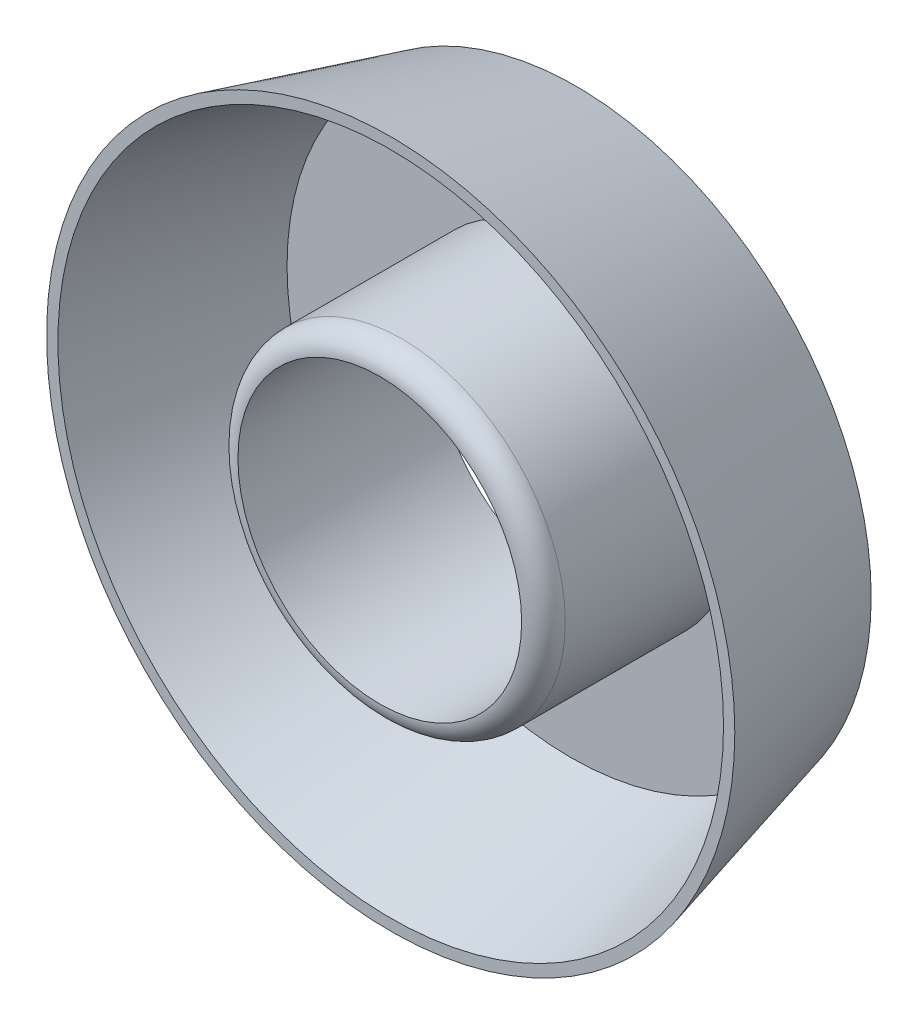
ISO-10303-21;
HEADER;
FILE_DESCRIPTION(('STEP AP214'),'2;1');
FILE_NAME('part.step','',(''),(''),'','','');
FILE_SCHEMA(('AUTOMOTIVE_DESIGN { 1 0 10303 214 1 1 1 1 }'));
ENDSEC;
DATA;
#1=APPLICATION_CONTEXT('core data for automotive mechanical design processes');
#2=APPLICATION_PROTOCOL_DEFINITION('international standard','automotive_design',2000,#1);
#3=PRODUCT_CONTEXT('',#1,'mechanical');
#4=PRODUCT('Part','Part','',(#3));
#5=PRODUCT_RELATED_PRODUCT_CATEGORY('part','',(#4));
#6=PRODUCT_DEFINITION_FORMATION('','',#4);
#7=PRODUCT_DEFINITION_CONTEXT('part definition',#1,'design');
#8=PRODUCT_DEFINITION('design','',#6,#7);
#9=PRODUCT_DEFINITION_SHAPE('','',#8);
#10=(LENGTH_UNIT() NAMED_UNIT(*) SI_UNIT(.MILLI.,.METRE.));
#11=(NAMED_UNIT(*) PLANE_ANGLE_UNIT() SI_UNIT($,.RADIAN.));
#12=(NAMED_UNIT(*) SI_UNIT($,.STERADIAN.) SOLID_ANGLE_UNIT());
#13=UNCERTAINTY_MEASURE_WITH_UNIT(LENGTH_MEASURE(1.E-05),#10,'distance_accuracy_value','');
#14=(GEOMETRIC_REPRESENTATION_CONTEXT(3) GLOBAL_UNCERTAINTY_ASSIGNED_CONTEXT((#13)) GLOBAL_UNIT_ASSIGNED_CONTEXT((#10,
#11,#12)) REPRESENTATION_CONTEXT('',''));
#15=CARTESIAN_POINT('',(0.,0.,0.));
#16=DIRECTION('',(0.,0.,1.));
#17=DIRECTION('',(1.,0.,0.));
#18=AXIS2_PLACEMENT_3D('',#15,#16,#17);
#19=CARTESIAN_POINT('',(0.,0.,0.));
#20=DIRECTION('',(0.,0.,1.));
#21=DIRECTION('',(1.,0.,0.));
#22=AXIS2_PLACEMENT_3D('',#19,#20,#21);
#23=PLANE('',#22);
#24=CARTESIAN_POINT('',(0.,0.,0.));
#25=DIRECTION('',(0.,0.,1.));
#26=DIRECTION('',(1.,0.,0.));
#27=AXIS2_PLACEMENT_3D('',#24,#25,#26);
#28=CIRCLE('',#27,27.0344414938276);
#29=CARTESIAN_POINT('',(27.0344414938276,0.,0.));
#30=VERTEX_POINT('',#29);
#31=EDGE_CURVE('E12',#30,#30,#28,.T.);
#32=ORIENTED_EDGE('',*,*,#31,.F.);
#33=EDGE_LOOP('',(#32));
#34=FACE_BOUND('',#33,.T.);
#35=CARTESIAN_POINT('',(0.,0.,0.));
#36=DIRECTION('',(0.,0.,1.));
#37=DIRECTION('',(1.,0.,0.));
#38=AXIS2_PLACEMENT_3D('',#35,#36,#37);
#39=CIRCLE('',#38,26.);
#40=CARTESIAN_POINT('',(26.,0.,0.));
#41=VERTEX_POINT('',#40);
#42=EDGE_CURVE('E57',#41,#41,#39,.T.);
#43=ORIENTED_EDGE('',*,*,#42,.T.);
#44=EDGE_LOOP('',(#43));
#45=FACE_BOUND('',#44,.T.);
#46=ADVANCED_FACE('F46',(#34,#45),#23,.F.);
#47=CARTESIAN_POINT('',(0.,0.,17.));
#48=DIRECTION('',(0.,0.,1.));
#49=DIRECTION('',(1.,0.,0.));
#50=AXIS2_PLACEMENT_3D('',#47,#48,#49);
#51=PLANE('',#50);
#52=CARTESIAN_POINT('',(0.,0.,17.));
#53=DIRECTION('',(0.,0.,1.));
#54=DIRECTION('',(1.,0.,0.));
#55=AXIS2_PLACEMENT_3D('',#52,#53,#54);
#56=CIRCLE('',#55,30.5);
#57=CARTESIAN_POINT('',(30.5,0.,17.));
#58=VERTEX_POINT('',#57);
#59=EDGE_CURVE('E59',#58,#58,#56,.T.);
#60=ORIENTED_EDGE('',*,*,#59,.F.);
#61=EDGE_LOOP('',(#60));
#62=FACE_BOUND('',#61,.T.);
#63=CARTESIAN_POINT('',(0.,0.,17.));
#64=DIRECTION('',(0.,0.,1.));
#65=DIRECTION('',(1.,0.,0.));
#66=AXIS2_PLACEMENT_3D('',#63,#64,#65);
#67=CIRCLE('',#66,31.5344414938276);
#68=CARTESIAN_POINT('',(31.5344414938276,0.,17.));
#69=VERTEX_POINT('',#68);
#70=EDGE_CURVE('E50',#69,#69,#67,.T.);
#71=ORIENTED_EDGE('',*,*,#70,.T.);
#72=EDGE_LOOP('',(#71));
#73=FACE_BOUND('',#72,.T.);
#74=ADVANCED_FACE('F72',(#62,#73),#51,.T.);
#75=CARTESIAN_POINT('',(0.,0.,-0.255892560316282));
#76=DIRECTION('',(0.,0.,1.));
#77=DIRECTION('',(1.,0.,0.));
#78=AXIS2_PLACEMENT_3D('',#75,#76,#77);
#79=CONICAL_SURFACE('',#78,26.9667052278615,0.258770891963697);
#80=ORIENTED_EDGE('',*,*,#31,.T.);
#81=EDGE_LOOP('',(#80));
#82=FACE_BOUND('',#81,.T.);
#83=ORIENTED_EDGE('',*,*,#70,.F.);
#84=EDGE_LOOP('',(#83));
#85=FACE_BOUND('',#84,.T.);
#86=ADVANCED_FACE('F48',(#82,#85),#79,.T.);
#87=CARTESIAN_POINT('',(0.,0.,0.));
#88=DIRECTION('',(0.,0.,1.));
#89=DIRECTION('',(1.,0.,0.));
#90=AXIS2_PLACEMENT_3D('',#87,#88,#89);
#91=CONICAL_SURFACE('',#90,26.,0.258770891963697);
#92=ORIENTED_EDGE('',*,*,#42,.F.);
#93=EDGE_LOOP('',(#92));
#94=FACE_BOUND('',#93,.T.);
#95=ORIENTED_EDGE('',*,*,#59,.T.);
#96=EDGE_LOOP('',(#95));
#97=FACE_BOUND('',#96,.T.);
#98=ADVANCED_FACE('F66',(#94,#97),#91,.F.);
#99=CLOSED_SHELL('',(#46,#74,#86,#98));
#100=MANIFOLD_SOLID_BREP('B2',#99);
#101=CARTESIAN_POINT('',(0.,0.,0.5));
#102=DIRECTION('',(0.,0.,1.));
#103=DIRECTION('',(1.,0.,0.));
#104=AXIS2_PLACEMENT_3D('',#101,#102,#103);
#105=PLANE('',#104);
#106=CARTESIAN_POINT('',(0.,0.,0.5));
#107=DIRECTION('',(0.,0.,1.));
#108=DIRECTION('',(1.,0.,0.));
#109=AXIS2_PLACEMENT_3D('',#106,#107,#108);
#110=CIRCLE('',#109,26.);
#111=CARTESIAN_POINT('',(26.,0.,0.5));
#112=VERTEX_POINT('',#111);
#113=EDGE_CURVE('E115',#112,#112,#110,.T.);
#114=ORIENTED_EDGE('',*,*,#113,.T.);
#115=EDGE_LOOP('',(#114));
#116=FACE_BOUND('',#115,.T.);
#117=CARTESIAN_POINT('',(0.,0.,0.5));
#118=DIRECTION('',(0.,0.,1.));
#119=DIRECTION('',(1.,0.,0.));
#120=AXIS2_PLACEMENT_3D('',#117,#118,#119);
#121=CIRCLE('',#120,15.);
#122=CARTESIAN_POINT('',(15.,0.,0.5));
#123=VERTEX_POINT('',#122);
#124=EDGE_CURVE('E128',#123,#123,#121,.F.);
#125=ORIENTED_EDGE('',*,*,#124,.T.);
#126=EDGE_LOOP('',(#125));
#127=FACE_BOUND('',#126,.T.);
#128=ADVANCED_FACE('F108',(#116,#127),#105,.T.);
#129=CARTESIAN_POINT('',(0.,0.,0.));
#130=DIRECTION('',(0.,0.,1.));
#131=DIRECTION('',(1.,0.,0.));
#132=AXIS2_PLACEMENT_3D('',#129,#130,#131);
#133=PLANE('',#132);
#134=CARTESIAN_POINT('',(0.,0.,0.));
#135=DIRECTION('',(0.,0.,1.));
#136=DIRECTION('',(1.,0.,0.));
#137=AXIS2_PLACEMENT_3D('',#134,#135,#136);
#138=CIRCLE('',#137,13.);
#139=CARTESIAN_POINT('',(13.,0.,0.));
#140=VERTEX_POINT('',#139);
#141=EDGE_CURVE('E124',#140,#140,#138,.T.);
#142=ORIENTED_EDGE('',*,*,#141,.T.);
#143=EDGE_LOOP('',(#142));
#144=FACE_BOUND('',#143,.T.);
#145=CARTESIAN_POINT('',(0.,0.,0.));
#146=DIRECTION('',(0.,0.,1.));
#147=DIRECTION('',(1.,0.,0.));
#148=AXIS2_PLACEMENT_3D('',#145,#146,#147);
#149=CIRCLE('',#148,26.);
#150=CARTESIAN_POINT('',(26.,0.,0.));
#151=VERTEX_POINT('',#150);
#152=EDGE_CURVE('E119',#151,#151,#149,.T.);
#153=ORIENTED_EDGE('',*,*,#152,.F.);
#154=EDGE_LOOP('',(#153));
#155=FACE_BOUND('',#154,.T.);
#156=ADVANCED_FACE('F145',(#144,#155),#133,.F.);
#157=CARTESIAN_POINT('',(0.,0.,0.5));
#158=DIRECTION('',(0.,0.,-1.));
#159=DIRECTION('',(-1.,0.,0.));
#160=AXIS2_PLACEMENT_3D('',#157,#158,#159);
#161=CYLINDRICAL_SURFACE('',#160,26.);
#162=ORIENTED_EDGE('',*,*,#113,.F.);
#163=EDGE_LOOP('',(#162));
#164=FACE_BOUND('',#163,.T.);
#165=ORIENTED_EDGE('',*,*,#152,.T.);
#166=EDGE_LOOP('',(#165));
#167=FACE_BOUND('',#166,.T.);
#168=ADVANCED_FACE('F151',(#164,#167),#161,.T.);
#169=CARTESIAN_POINT('',(0.,0.,0.5));
#170=DIRECTION('',(0.,0.,-1.));
#171=DIRECTION('',(-1.,0.,0.));
#172=AXIS2_PLACEMENT_3D('',#169,#170,#171);
#173=CYLINDRICAL_SURFACE('',#172,13.);
#174=ORIENTED_EDGE('',*,*,#141,.F.);
#175=EDGE_LOOP('',(#174));
#176=FACE_BOUND('',#175,.T.);
#177=CARTESIAN_POINT('',(0.,0.,18.));
#178=DIRECTION('',(0.,0.,1.));
#179=DIRECTION('',(1.,0.,0.));
#180=AXIS2_PLACEMENT_3D('',#177,#178,#179);
#181=CIRCLE('',#180,13.);
#182=CARTESIAN_POINT('',(13.,0.,18.));
#183=VERTEX_POINT('',#182);
#184=EDGE_CURVE('E131',#183,#183,#181,.T.);
#185=ORIENTED_EDGE('',*,*,#184,.T.);
#186=EDGE_LOOP('',(#185));
#187=FACE_BOUND('',#186,.T.);
#188=ADVANCED_FACE('F135',(#176,#187),#173,.F.);
#189=CARTESIAN_POINT('',(0.,0.,18.));
#190=DIRECTION('',(0.,0.,-1.));
#191=DIRECTION('',(-1.,0.,0.));
#192=AXIS2_PLACEMENT_3D('',#189,#190,#191);
#193=CYLINDRICAL_SURFACE('',#192,15.);
#194=CARTESIAN_POINT('',(0.,0.,16.));
#195=DIRECTION('',(0.,0.,1.));
#196=DIRECTION('',(1.,0.,0.));
#197=AXIS2_PLACEMENT_3D('',#194,#195,#196);
#198=CIRCLE('',#197,15.);
#199=CARTESIAN_POINT('',(15.,0.,16.));
#200=VERTEX_POINT('',#199);
#201=EDGE_CURVE('E45',#200,#200,#198,.F.);
#202=ORIENTED_EDGE('',*,*,#201,.T.);
#203=EDGE_LOOP('',(#202));
#204=FACE_BOUND('',#203,.T.);
#205=ORIENTED_EDGE('',*,*,#124,.F.);
#206=EDGE_LOOP('',(#205));
#207=FACE_BOUND('',#206,.T.);
#208=ADVANCED_FACE('F138',(#204,#207),#193,.T.);
#209=CARTESIAN_POINT('',(0.,0.,16.));
#210=DIRECTION('',(0.,0.,1.));
#211=DIRECTION('',(1.,0.,0.));
#212=AXIS2_PLACEMENT_3D('',#209,#210,#211);
#213=TOROIDAL_SURFACE('',#212,13.,2.);
#214=ORIENTED_EDGE('',*,*,#201,.F.);
#215=EDGE_LOOP('',(#214));
#216=FACE_BOUND('',#215,.T.);
#217=ORIENTED_EDGE('',*,*,#184,.F.);
#218=EDGE_LOOP('',(#217));
#219=FACE_BOUND('',#218,.T.);
#220=ADVANCED_FACE('F110',(#216,#219),#213,.T.);
#221=CLOSED_SHELL('',(#128,#156,#168,#188,#208,#220));
#222=MANIFOLD_SOLID_BREP('B7',#221);
#223=ADVANCED_BREP_SHAPE_REPRESENTATION('',(#18,#100,#222),#14);
#224=SHAPE_DEFINITION_REPRESENTATION(#9,#223);
ENDSEC;
END-ISO-10303-21;
